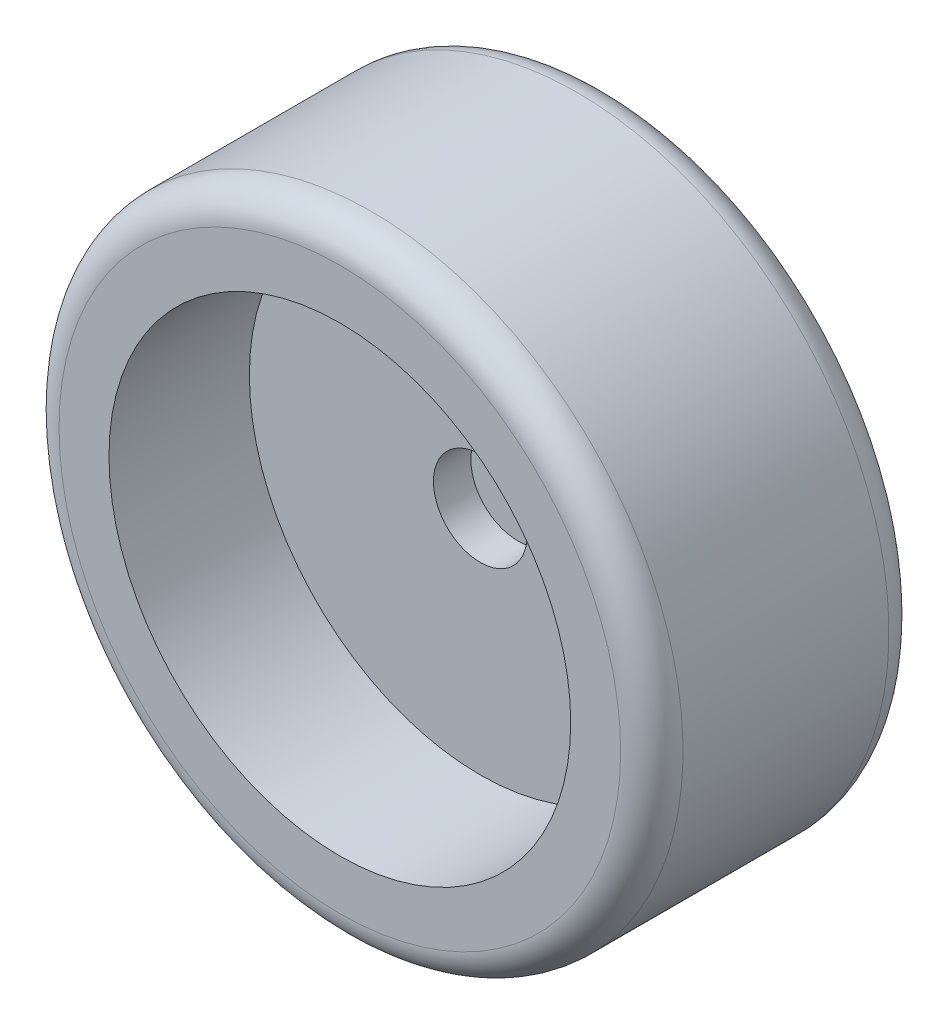
ISO-10303-21;
HEADER;
FILE_DESCRIPTION(('STEP AP214'),'2;1');
FILE_NAME('part.step','',(''),(''),'','','');
FILE_SCHEMA(('AUTOMOTIVE_DESIGN { 1 0 10303 214 1 1 1 1 }'));
ENDSEC;
DATA;
#1=APPLICATION_CONTEXT('core data for automotive mechanical design processes');
#2=APPLICATION_PROTOCOL_DEFINITION('international standard','automotive_design',2000,#1);
#3=PRODUCT_CONTEXT('',#1,'mechanical');
#4=PRODUCT('Part','Part','',(#3));
#5=PRODUCT_RELATED_PRODUCT_CATEGORY('part','',(#4));
#6=PRODUCT_DEFINITION_FORMATION('','',#4);
#7=PRODUCT_DEFINITION_CONTEXT('part definition',#1,'design');
#8=PRODUCT_DEFINITION('design','',#6,#7);
#9=PRODUCT_DEFINITION_SHAPE('','',#8);
#10=(LENGTH_UNIT() NAMED_UNIT(*) SI_UNIT(.MILLI.,.METRE.));
#11=(NAMED_UNIT(*) PLANE_ANGLE_UNIT() SI_UNIT($,.RADIAN.));
#12=(NAMED_UNIT(*) SI_UNIT($,.STERADIAN.) SOLID_ANGLE_UNIT());
#13=UNCERTAINTY_MEASURE_WITH_UNIT(LENGTH_MEASURE(1.E-05),#10,'distance_accuracy_value','');
#14=(GEOMETRIC_REPRESENTATION_CONTEXT(3) GLOBAL_UNCERTAINTY_ASSIGNED_CONTEXT((#13)) GLOBAL_UNIT_ASSIGNED_CONTEXT((#10,
#11,#12)) REPRESENTATION_CONTEXT('',''));
#15=CARTESIAN_POINT('',(0.,0.,0.));
#16=DIRECTION('',(0.,0.,1.));
#17=DIRECTION('',(1.,0.,0.));
#18=AXIS2_PLACEMENT_3D('',#15,#16,#17);
#19=CARTESIAN_POINT('',(0.,0.,43.));
#20=DIRECTION('',(0.,0.,-1.));
#21=DIRECTION('',(-1.,0.,0.));
#22=AXIS2_PLACEMENT_3D('',#19,#20,#21);
#23=CYLINDRICAL_SURFACE('',#22,7.5);
#24=CARTESIAN_POINT('',(0.,0.,14.5));
#25=DIRECTION('',(0.,0.,-1.));
#26=DIRECTION('',(-1.,0.,0.));
#27=AXIS2_PLACEMENT_3D('',#24,#25,#26);
#28=CIRCLE('',#27,7.5);
#29=CARTESIAN_POINT('',(-7.5,0.,14.5));
#30=VERTEX_POINT('',#29);
#31=EDGE_CURVE('E10',#30,#30,#28,.T.);
#32=ORIENTED_EDGE('',*,*,#31,.T.);
#33=EDGE_LOOP('',(#32));
#34=FACE_BOUND('',#33,.T.);
#35=CARTESIAN_POINT('',(0.,0.,20.5));
#36=DIRECTION('',(0.,0.,-1.));
#37=DIRECTION('',(-1.,0.,0.));
#38=AXIS2_PLACEMENT_3D('',#35,#36,#37);
#39=CIRCLE('',#38,7.5);
#40=CARTESIAN_POINT('',(-7.5,0.,20.5));
#41=VERTEX_POINT('',#40);
#42=EDGE_CURVE('E66',#41,#41,#39,.T.);
#43=ORIENTED_EDGE('',*,*,#42,.F.);
#44=EDGE_LOOP('',(#43));
#45=FACE_BOUND('',#44,.T.);
#46=ADVANCED_FACE('F38',(#34,#45),#23,.F.);
#47=CARTESIAN_POINT('',(7.5,0.,14.5));
#48=DIRECTION('',(0.,0.,1.));
#49=DIRECTION('',(1.,0.,0.));
#50=AXIS2_PLACEMENT_3D('',#47,#48,#49);
#51=PLANE('',#50);
#52=ORIENTED_EDGE('',*,*,#31,.F.);
#53=EDGE_LOOP('',(#52));
#54=FACE_BOUND('',#53,.T.);
#55=ADVANCED_FACE('F74',(#54),#51,.T.);
#56=CARTESIAN_POINT('',(0.,0.,0.));
#57=DIRECTION('',(0.,0.,-1.));
#58=DIRECTION('',(-1.,0.,0.));
#59=AXIS2_PLACEMENT_3D('',#56,#57,#58);
#60=PLANE('',#59);
#61=CARTESIAN_POINT('',(0.,0.,0.));
#62=DIRECTION('',(0.,0.,-1.));
#63=DIRECTION('',(-1.,0.,0.));
#64=AXIS2_PLACEMENT_3D('',#61,#62,#63);
#65=CIRCLE('',#64,45.);
#66=CARTESIAN_POINT('',(-45.,0.,0.));
#67=VERTEX_POINT('',#66);
#68=EDGE_CURVE('E44',#67,#67,#65,.T.);
#69=ORIENTED_EDGE('',*,*,#68,.T.);
#70=EDGE_LOOP('',(#69));
#71=FACE_BOUND('',#70,.T.);
#72=ADVANCED_FACE('F78',(#71),#60,.T.);
#73=CARTESIAN_POINT('',(0.,0.,5.));
#74=DIRECTION('',(0.,0.,-1.));
#75=DIRECTION('',(-1.,0.,0.));
#76=AXIS2_PLACEMENT_3D('',#73,#74,#75);
#77=TOROIDAL_SURFACE('',#76,45.,5.);
#78=CARTESIAN_POINT('',(0.,0.,5.));
#79=DIRECTION('',(0.,0.,-1.));
#80=DIRECTION('',(-1.,0.,0.));
#81=AXIS2_PLACEMENT_3D('',#78,#79,#80);
#82=CIRCLE('',#81,50.);
#83=CARTESIAN_POINT('',(-50.,0.,5.));
#84=VERTEX_POINT('',#83);
#85=EDGE_CURVE('E48',#84,#84,#82,.T.);
#86=ORIENTED_EDGE('',*,*,#85,.T.);
#87=EDGE_LOOP('',(#86));
#88=FACE_BOUND('',#87,.T.);
#89=ORIENTED_EDGE('',*,*,#68,.F.);
#90=EDGE_LOOP('',(#89));
#91=FACE_BOUND('',#90,.T.);
#92=ADVANCED_FACE('F83',(#88,#91),#77,.T.);
#93=CARTESIAN_POINT('',(0.,0.,43.));
#94=DIRECTION('',(0.,0.,-1.));
#95=DIRECTION('',(-1.,0.,0.));
#96=AXIS2_PLACEMENT_3D('',#93,#94,#95);
#97=CYLINDRICAL_SURFACE('',#96,50.);
#98=CARTESIAN_POINT('',(0.,0.,38.));
#99=DIRECTION('',(0.,0.,-1.));
#100=DIRECTION('',(-1.,0.,0.));
#101=AXIS2_PLACEMENT_3D('',#98,#99,#100);
#102=CIRCLE('',#101,50.);
#103=CARTESIAN_POINT('',(-50.,0.,38.));
#104=VERTEX_POINT('',#103);
#105=EDGE_CURVE('E52',#104,#104,#102,.T.);
#106=ORIENTED_EDGE('',*,*,#105,.T.);
#107=EDGE_LOOP('',(#106));
#108=FACE_BOUND('',#107,.T.);
#109=ORIENTED_EDGE('',*,*,#85,.F.);
#110=EDGE_LOOP('',(#109));
#111=FACE_BOUND('',#110,.T.);
#112=ADVANCED_FACE('F88',(#108,#111),#97,.T.);
#113=CARTESIAN_POINT('',(0.,0.,38.));
#114=DIRECTION('',(0.,0.,-1.));
#115=DIRECTION('',(-1.,0.,0.));
#116=AXIS2_PLACEMENT_3D('',#113,#114,#115);
#117=TOROIDAL_SURFACE('',#116,45.,5.);
#118=CARTESIAN_POINT('',(0.,0.,43.));
#119=DIRECTION('',(0.,0.,-1.));
#120=DIRECTION('',(-1.,0.,0.));
#121=AXIS2_PLACEMENT_3D('',#118,#119,#120);
#122=CIRCLE('',#121,45.);
#123=CARTESIAN_POINT('',(-45.,0.,43.));
#124=VERTEX_POINT('',#123);
#125=EDGE_CURVE('E57',#124,#124,#122,.T.);
#126=ORIENTED_EDGE('',*,*,#125,.T.);
#127=EDGE_LOOP('',(#126));
#128=FACE_BOUND('',#127,.T.);
#129=ORIENTED_EDGE('',*,*,#105,.F.);
#130=EDGE_LOOP('',(#129));
#131=FACE_BOUND('',#130,.T.);
#132=ADVANCED_FACE('F92',(#128,#131),#117,.T.);
#133=CARTESIAN_POINT('',(45.,0.,43.));
#134=DIRECTION('',(0.,0.,1.));
#135=DIRECTION('',(1.,0.,0.));
#136=AXIS2_PLACEMENT_3D('',#133,#134,#135);
#137=PLANE('',#136);
#138=CARTESIAN_POINT('',(0.,0.,43.));
#139=DIRECTION('',(0.,0.,-1.));
#140=DIRECTION('',(-1.,0.,0.));
#141=AXIS2_PLACEMENT_3D('',#138,#139,#140);
#142=CIRCLE('',#141,37.);
#143=CARTESIAN_POINT('',(-37.,0.,43.));
#144=VERTEX_POINT('',#143);
#145=EDGE_CURVE('E60',#144,#144,#142,.T.);
#146=ORIENTED_EDGE('',*,*,#145,.T.);
#147=EDGE_LOOP('',(#146));
#148=FACE_BOUND('',#147,.T.);
#149=ORIENTED_EDGE('',*,*,#125,.F.);
#150=EDGE_LOOP('',(#149));
#151=FACE_BOUND('',#150,.T.);
#152=ADVANCED_FACE('F96',(#148,#151),#137,.T.);
#153=CARTESIAN_POINT('',(0.,0.,43.));
#154=DIRECTION('',(0.,0.,-1.));
#155=DIRECTION('',(-1.,0.,0.));
#156=AXIS2_PLACEMENT_3D('',#153,#154,#155);
#157=CYLINDRICAL_SURFACE('',#156,37.);
#158=CARTESIAN_POINT('',(0.,0.,20.5));
#159=DIRECTION('',(0.,0.,-1.));
#160=DIRECTION('',(-1.,0.,0.));
#161=AXIS2_PLACEMENT_3D('',#158,#159,#160);
#162=CIRCLE('',#161,37.);
#163=CARTESIAN_POINT('',(-37.,0.,20.5));
#164=VERTEX_POINT('',#163);
#165=EDGE_CURVE('E63',#164,#164,#162,.T.);
#166=ORIENTED_EDGE('',*,*,#165,.T.);
#167=EDGE_LOOP('',(#166));
#168=FACE_BOUND('',#167,.T.);
#169=ORIENTED_EDGE('',*,*,#145,.F.);
#170=EDGE_LOOP('',(#169));
#171=FACE_BOUND('',#170,.T.);
#172=ADVANCED_FACE('F100',(#168,#171),#157,.F.);
#173=CARTESIAN_POINT('',(37.,0.,20.5));
#174=DIRECTION('',(0.,0.,1.));
#175=DIRECTION('',(1.,0.,0.));
#176=AXIS2_PLACEMENT_3D('',#173,#174,#175);
#177=PLANE('',#176);
#178=ORIENTED_EDGE('',*,*,#42,.T.);
#179=EDGE_LOOP('',(#178));
#180=FACE_BOUND('',#179,.T.);
#181=ORIENTED_EDGE('',*,*,#165,.F.);
#182=EDGE_LOOP('',(#181));
#183=FACE_BOUND('',#182,.T.);
#184=ADVANCED_FACE('F70',(#180,#183),#177,.T.);
#185=CLOSED_SHELL('',(#46,#55,#72,#92,#112,#132,#152,#172,#184));
#186=MANIFOLD_SOLID_BREP('B2',#185);
#187=ADVANCED_BREP_SHAPE_REPRESENTATION('',(#18,#186),#14);
#188=SHAPE_DEFINITION_REPRESENTATION(#9,#187);
ENDSEC;
END-ISO-10303-21;
